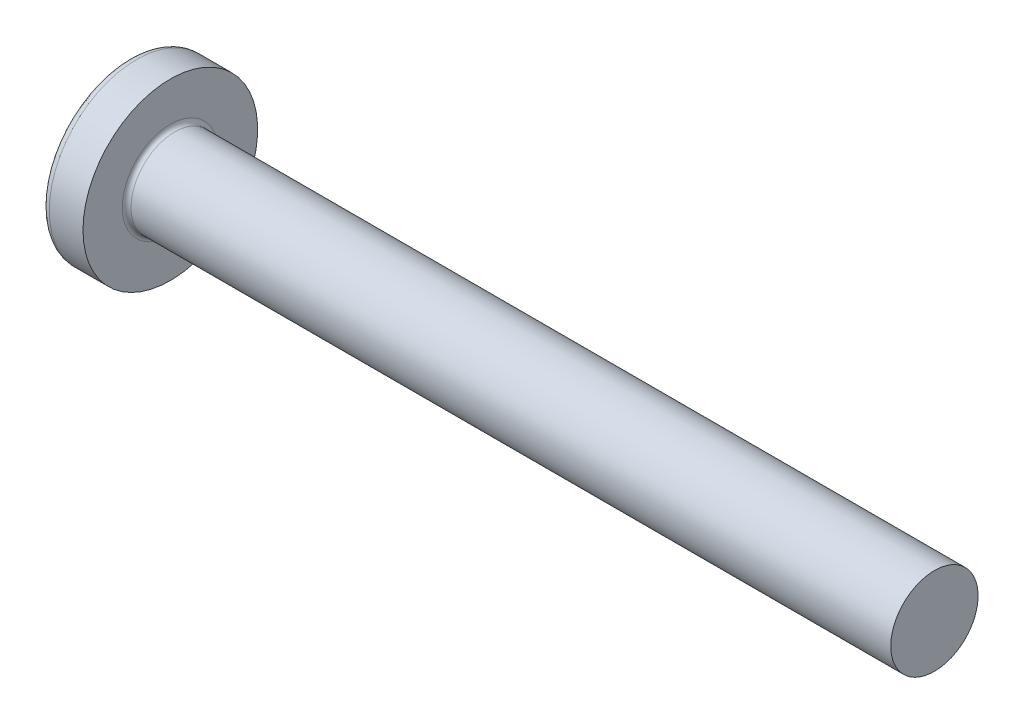
ISO-10303-21;
HEADER;
FILE_DESCRIPTION(('STEP AP214'),'2;1');
FILE_NAME('part.step','',(''),(''),'','','');
FILE_SCHEMA(('AUTOMOTIVE_DESIGN { 1 0 10303 214 1 1 1 1 }'));
ENDSEC;
DATA;
#1=APPLICATION_CONTEXT('core data for automotive mechanical design processes');
#2=APPLICATION_PROTOCOL_DEFINITION('international standard','automotive_design',2000,#1);
#3=PRODUCT_CONTEXT('',#1,'mechanical');
#4=PRODUCT('Part','Part','',(#3));
#5=PRODUCT_RELATED_PRODUCT_CATEGORY('part','',(#4));
#6=PRODUCT_DEFINITION_FORMATION('','',#4);
#7=PRODUCT_DEFINITION_CONTEXT('part definition',#1,'design');
#8=PRODUCT_DEFINITION('design','',#6,#7);
#9=PRODUCT_DEFINITION_SHAPE('','',#8);
#10=(LENGTH_UNIT() NAMED_UNIT(*) SI_UNIT(.MILLI.,.METRE.));
#11=(NAMED_UNIT(*) PLANE_ANGLE_UNIT() SI_UNIT($,.RADIAN.));
#12=(NAMED_UNIT(*) SI_UNIT($,.STERADIAN.) SOLID_ANGLE_UNIT());
#13=UNCERTAINTY_MEASURE_WITH_UNIT(LENGTH_MEASURE(1.E-05),#10,'distance_accuracy_value','');
#14=(GEOMETRIC_REPRESENTATION_CONTEXT(3) GLOBAL_UNCERTAINTY_ASSIGNED_CONTEXT((#13)) GLOBAL_UNIT_ASSIGNED_CONTEXT((#10,
#11,#12)) REPRESENTATION_CONTEXT('',''));
#15=CARTESIAN_POINT('',(0.,0.,0.));
#16=DIRECTION('',(0.,0.,1.));
#17=DIRECTION('',(1.,0.,0.));
#18=AXIS2_PLACEMENT_3D('',#15,#16,#17);
#19=CARTESIAN_POINT('',(6.5,0.,0.));
#20=DIRECTION('',(-1.,0.,0.));
#21=DIRECTION('',(0.,1.,0.));
#22=AXIS2_PLACEMENT_3D('',#19,#20,#21);
#23=SPHERICAL_SURFACE('',#22,6.5);
#24=CARTESIAN_POINT('',(1.26538895452803,0.,0.));
#25=DIRECTION('',(-1.,0.,0.));
#26=DIRECTION('',(0.,0.,1.));
#27=AXIS2_PLACEMENT_3D('',#24,#25,#26);
#28=CIRCLE('',#27,3.85342019543974);
#29=CARTESIAN_POINT('',(1.26538895452803,0.,3.85342019543974));
#30=VERTEX_POINT('',#29);
#31=EDGE_CURVE('E213',#30,#30,#28,.T.);
#32=ORIENTED_EDGE('',*,*,#31,.T.);
#33=EDGE_LOOP('',(#32));
#34=FACE_BOUND('',#33,.T.);
#35=CARTESIAN_POINT('',(0.0788099820016241,0.,0.));
#36=DIRECTION('',(1.,0.,0.));
#37=DIRECTION('',(0.,0.,-1.));
#38=AXIS2_PLACEMENT_3D('',#35,#36,#37);
#39=CIRCLE('',#38,1.0091178091571);
#40=CARTESIAN_POINT('',(0.0788099820016244,-0.514999999999996,-0.867809744562728));
#41=VERTEX_POINT('',#40);
#42=CARTESIAN_POINT('',(0.0788099820016241,-0.867809744562729,-0.515));
#43=VERTEX_POINT('',#42);
#44=EDGE_CURVE('E339',#41,#43,#39,.F.);
#45=ORIENTED_EDGE('',*,*,#44,.F.);
#46=CARTESIAN_POINT('',(6.5,-0.515000000000001,0.));
#47=DIRECTION('',(0.,1.,0.));
#48=DIRECTION('',(0.,0.,1.));
#49=AXIS2_PLACEMENT_3D('',#46,#47,#48);
#50=CIRCLE('',#49,6.47956595768575);
#51=CARTESIAN_POINT('',(0.331830520157854,-0.514999999999992,-1.98455543332603));
#52=VERTEX_POINT('',#51);
#53=EDGE_CURVE('E273',#52,#41,#50,.T.);
#54=ORIENTED_EDGE('',*,*,#53,.F.);
#55=CARTESIAN_POINT('',(6.06443225879603,0.,0.873613881878153));
#56=DIRECTION('',(0.446197753347436,0.,-0.894934391398443));
#57=DIRECTION('',(-0.894934391398442,0.,-0.446197753347436));
#58=AXIS2_PLACEMENT_3D('',#55,#56,#57);
#59=CIRCLE('',#58,6.42628038045433);
#60=CARTESIAN_POINT('',(0.331830520157856,0.515000000000007,-1.98455543332603));
#61=VERTEX_POINT('',#60);
#62=EDGE_CURVE('E247',#52,#61,#59,.T.);
#63=ORIENTED_EDGE('',*,*,#62,.T.);
#64=CARTESIAN_POINT('',(6.5,0.515,0.));
#65=DIRECTION('',(0.,-1.,0.));
#66=DIRECTION('',(0.,0.,-1.));
#67=AXIS2_PLACEMENT_3D('',#64,#65,#66);
#68=CIRCLE('',#67,6.47956595768574);
#69=CARTESIAN_POINT('',(0.0788099820016249,0.515000000000003,-0.867809744562724));
#70=VERTEX_POINT('',#69);
#71=EDGE_CURVE('E301',#70,#61,#68,.T.);
#72=ORIENTED_EDGE('',*,*,#71,.F.);
#73=CARTESIAN_POINT('',(0.0788099820016241,0.867809744562719,-0.515));
#74=VERTEX_POINT('',#73);
#75=EDGE_CURVE('E354',#74,#70,#39,.F.);
#76=ORIENTED_EDGE('',*,*,#75,.F.);
#77=CARTESIAN_POINT('',(6.5,0.,-0.515));
#78=DIRECTION('',(0.,0.,1.));
#79=DIRECTION('',(1.,0.,0.));
#80=AXIS2_PLACEMENT_3D('',#77,#78,#79);
#81=CIRCLE('',#80,6.47956595768574);
#82=CARTESIAN_POINT('',(0.331830520157856,1.98455543332603,-0.515));
#83=VERTEX_POINT('',#82);
#84=EDGE_CURVE('E241',#83,#74,#81,.T.);
#85=ORIENTED_EDGE('',*,*,#84,.F.);
#86=CARTESIAN_POINT('',(6.06443225879604,-0.873613881878154,0.));
#87=DIRECTION('',(0.446197753347436,0.894934391398443,0.));
#88=DIRECTION('',(-0.894934391398442,0.446197753347436,0.));
#89=AXIS2_PLACEMENT_3D('',#86,#87,#88);
#90=CIRCLE('',#89,6.42628038045433);
#91=CARTESIAN_POINT('',(0.331830520157857,1.98455543332603,0.515));
#92=VERTEX_POINT('',#91);
#93=EDGE_CURVE('E244',#83,#92,#90,.T.);
#94=ORIENTED_EDGE('',*,*,#93,.T.);
#95=CARTESIAN_POINT('',(6.5,0.,0.515000000000001));
#96=DIRECTION('',(0.,0.,-1.));
#97=DIRECTION('',(-1.,0.,0.));
#98=AXIS2_PLACEMENT_3D('',#95,#96,#97);
#99=CIRCLE('',#98,6.47956595768574);
#100=CARTESIAN_POINT('',(0.0788099820016241,0.867809744562719,0.514999999999999));
#101=VERTEX_POINT('',#100);
#102=EDGE_CURVE('E237',#101,#92,#99,.T.);
#103=ORIENTED_EDGE('',*,*,#102,.F.);
#104=CARTESIAN_POINT('',(0.0788099820016253,0.514999999999997,0.867809744562727));
#105=VERTEX_POINT('',#104);
#106=EDGE_CURVE('E353',#105,#101,#39,.F.);
#107=ORIENTED_EDGE('',*,*,#106,.F.);
#108=CARTESIAN_POINT('',(0.331830520157856,0.514999999999993,1.98455543332603));
#109=VERTEX_POINT('',#108);
#110=EDGE_CURVE('E257',#109,#105,#68,.T.);
#111=ORIENTED_EDGE('',*,*,#110,.F.);
#112=CARTESIAN_POINT('',(6.06443225879603,0.,-0.873613881878153));
#113=DIRECTION('',(0.446197753347436,0.,0.894934391398443));
#114=DIRECTION('',(0.894934391398442,0.,-0.446197753347436));
#115=AXIS2_PLACEMENT_3D('',#112,#113,#114);
#116=CIRCLE('',#115,6.42628038045433);
#117=CARTESIAN_POINT('',(0.331830520157855,-0.515000000000007,1.98455543332603));
#118=VERTEX_POINT('',#117);
#119=EDGE_CURVE('E48',#109,#118,#116,.T.);
#120=ORIENTED_EDGE('',*,*,#119,.T.);
#121=CARTESIAN_POINT('',(0.0788099820016247,-0.515000000000003,0.867809744562724));
#122=VERTEX_POINT('',#121);
#123=EDGE_CURVE('E254',#122,#118,#50,.T.);
#124=ORIENTED_EDGE('',*,*,#123,.F.);
#125=CARTESIAN_POINT('',(0.0788099820016241,-0.867809744562729,0.514999999999999));
#126=VERTEX_POINT('',#125);
#127=EDGE_CURVE('E385',#126,#122,#39,.F.);
#128=ORIENTED_EDGE('',*,*,#127,.F.);
#129=CARTESIAN_POINT('',(0.331830520157853,-1.98455543332603,0.514999999999999));
#130=VERTEX_POINT('',#129);
#131=EDGE_CURVE('E238',#130,#126,#99,.T.);
#132=ORIENTED_EDGE('',*,*,#131,.F.);
#133=CARTESIAN_POINT('',(6.06443225879603,0.873613881878152,0.));
#134=DIRECTION('',(0.446197753347436,-0.894934391398443,0.));
#135=DIRECTION('',(0.894934391398442,0.446197753347436,0.));
#136=AXIS2_PLACEMENT_3D('',#133,#134,#135);
#137=CIRCLE('',#136,6.42628038045433);
#138=CARTESIAN_POINT('',(0.331830520157853,-1.98455543332603,-0.515));
#139=VERTEX_POINT('',#138);
#140=EDGE_CURVE('E234',#130,#139,#137,.T.);
#141=ORIENTED_EDGE('',*,*,#140,.T.);
#142=EDGE_CURVE('E63',#43,#139,#81,.T.);
#143=ORIENTED_EDGE('',*,*,#142,.F.);
#144=EDGE_LOOP('',(#45,#54,#63,#72,#76,#85,#94,#103,#107,#111,#120,#124,#128,#132,#141,#143));
#145=FACE_BOUND('',#144,.T.);
#146=ADVANCED_FACE('F35',(#34,#145),#23,.T.);
#147=CARTESIAN_POINT('',(0.,2.15,-0.515));
#148=DIRECTION('',(0.,0.,1.));
#149=DIRECTION('',(1.,0.,0.));
#150=AXIS2_PLACEMENT_3D('',#147,#148,#149);
#151=PLANE('',#150);
#152=ORIENTED_EDGE('',*,*,#84,.T.);
#153=CARTESIAN_POINT('',(-1.51195208675156,0.994972220320188,-0.515));
#154=CARTESIAN_POINT('',(-1.20405981949279,0.970722016949958,-0.515));
#155=CARTESIAN_POINT('',(-0.896180907521174,0.946299109919651,-0.515));
#156=CARTESIAN_POINT('',(-0.280449079832185,0.896981122427851,-0.515));
#157=CARTESIAN_POINT('',(0.0274038344396873,0.872086023934883,-0.515));
#158=CARTESIAN_POINT('',(0.489146739515351,0.83429553519528,-0.515));
#159=CARTESIAN_POINT('',(0.643055047553846,0.821624058404092,-0.515));
#160=CARTESIAN_POINT('',(0.950856520197141,0.796108332639504,-0.515));
#161=CARTESIAN_POINT('',(1.10474968487868,0.783264084592465,-0.515));
#162=CARTESIAN_POINT('',(1.41251352095103,0.757376569093378,-0.515));
#163=CARTESIAN_POINT('',(1.56638419296577,0.744333309065218,-0.515));
#164=CARTESIAN_POINT('',(1.87410847343335,0.718013273188896,-0.515));
#165=CARTESIAN_POINT('',(2.02796208151372,0.704736492982792,-0.515));
#166=CARTESIAN_POINT('',(2.36455311890989,0.675386943006726,-0.515));
#167=CARTESIAN_POINT('',(2.54728562293342,0.659257575640986,-0.515));
#168=CARTESIAN_POINT('',(2.91270624109256,0.626517182479888,-0.515));
#169=CARTESIAN_POINT('',(3.09539435554038,0.609906160177238,-0.515));
#170=CARTESIAN_POINT('',(3.46069832191612,0.576073027116421,-0.515));
#171=CARTESIAN_POINT('',(3.64331417870068,0.558850968932727,-0.515));
#172=CARTESIAN_POINT('',(4.00847437496567,0.523604864540037,-0.515));
#173=CARTESIAN_POINT('',(4.19101871216888,0.505580794604253,-0.515));
#174=CARTESIAN_POINT('',(4.55606208157937,0.468429191666488,-0.515));
#175=CARTESIAN_POINT('',(4.73856107358022,0.449301262281854,-0.515));
#176=CARTESIAN_POINT('',(5.10337547353418,0.409473604748924,-0.515));
#177=CARTESIAN_POINT('',(5.28569089526422,0.388774005106069,-0.515));
#178=CARTESIAN_POINT('',(5.55897278495412,0.355828287527264,-0.515));
#179=CARTESIAN_POINT('',(5.65005277419686,0.344527918782738,-0.515));
#180=CARTESIAN_POINT('',(5.83209904103607,0.321075174263031,-0.515));
#181=CARTESIAN_POINT('',(5.92306532397915,0.308922840209686,-0.515));
#182=CARTESIAN_POINT('',(6.10486078872898,0.28342733445193,-0.515));
#183=CARTESIAN_POINT('',(6.19568992299379,0.270083817601714,-0.515));
#184=CARTESIAN_POINT('',(6.33172773785679,0.248701420809951,-0.515));
#185=CARTESIAN_POINT('',(6.37704304473344,0.241345446705304,-0.515));
#186=CARTESIAN_POINT('',(6.4675722520141,0.226018953559337,-0.515));
#187=CARTESIAN_POINT('',(6.51278614568083,0.218048394864476,-0.515));
#188=CARTESIAN_POINT('',(6.55793125759548,0.209691465274944,-0.515));
#189=B_SPLINE_CURVE_WITH_KNOTS('',3,(#153,#154,#155,#156,#157,#158,#159,#160,#161,#162,#163,
#164,#165,#166,#167,#168,#169,#170,#171,#172,#173,#174,#175,#176,#177,#178,#179,#180,#181,#182,
#183,#184,#185,#186,#187,#188),.UNSPECIFIED.,.F.,.F.,(4,2,2,2,2,2,2,2,2,2,2,2,2,2,2,2,2,4),(0.,
0.926537709781721,1.85311087258339,2.31639796016285,2.77968256468771,3.24294992902055,
3.70622594801777,4.25655436065378,4.80687878359543,5.35715597005738,5.90744944680718,
6.45794177197673,7.008389135274,7.28372117336898,7.55903973750591,7.83443833587748,
7.97216007460854,8.10989070671571),.UNSPECIFIED.);
#190=CARTESIAN_POINT('',(2.34,0.677477674908923,-0.515));
#191=VERTEX_POINT('',#190);
#192=EDGE_CURVE('E374',#74,#191,#189,.T.);
#193=ORIENTED_EDGE('',*,*,#192,.T.);
#194=DIRECTION('',(0.,1.,0.));
#195=VECTOR('',#194,1.);
#196=CARTESIAN_POINT('',(2.34,-0.983319232260742,-0.515));
#197=LINE('',#196,#195);
#198=CARTESIAN_POINT('',(2.34,0.983319232260743,-0.515));
#199=VERTEX_POINT('',#198);
#200=EDGE_CURVE('E322',#191,#199,#197,.T.);
#201=ORIENTED_EDGE('',*,*,#200,.T.);
#202=DIRECTION('',(0.894934391398442,-0.446197753347436,0.));
#203=VECTOR('',#202,1.);
#204=CARTESIAN_POINT('',(0.,2.15,-0.515));
#205=LINE('',#204,#203);
#206=EDGE_CURVE('E214',#83,#199,#205,.T.);
#207=ORIENTED_EDGE('',*,*,#206,.F.);
#208=EDGE_LOOP('',(#152,#193,#201,#207));
#209=FACE_BOUND('',#208,.T.);
#210=ADVANCED_FACE('F169',(#209),#151,.T.);
#211=CARTESIAN_POINT('',(2.34,-0.983319232260742,-0.515));
#212=VERTEX_POINT('',#211);
#213=CARTESIAN_POINT('',(2.34,-0.677477674908923,-0.515));
#214=VERTEX_POINT('',#213);
#215=EDGE_CURVE('E222',#212,#214,#197,.T.);
#216=ORIENTED_EDGE('',*,*,#215,.T.);
#217=CARTESIAN_POINT('',(-1.51195208675156,-0.994972220320188,-0.515));
#218=CARTESIAN_POINT('',(-1.20405981949279,-0.970722016949958,-0.515));
#219=CARTESIAN_POINT('',(-0.896180907521174,-0.946299109919651,-0.515));
#220=CARTESIAN_POINT('',(-0.280449079832185,-0.896981122427851,-0.515));
#221=CARTESIAN_POINT('',(0.027403834439687,-0.872086023934883,-0.515));
#222=CARTESIAN_POINT('',(0.48914673951535,-0.83429553519528,-0.515));
#223=CARTESIAN_POINT('',(0.643055047553845,-0.821624058404092,-0.515));
#224=CARTESIAN_POINT('',(0.95085652019714,-0.796108332639504,-0.515));
#225=CARTESIAN_POINT('',(1.10474968487868,-0.783264084592466,-0.515));
#226=CARTESIAN_POINT('',(1.41251352095103,-0.757376569093378,-0.515));
#227=CARTESIAN_POINT('',(1.56638419296577,-0.744333309065218,-0.515));
#228=CARTESIAN_POINT('',(1.87410847343335,-0.718013273188896,-0.515));
#229=CARTESIAN_POINT('',(2.02796208151372,-0.704736492982792,-0.515));
#230=CARTESIAN_POINT('',(2.36455311890989,-0.675386943006726,-0.515));
#231=CARTESIAN_POINT('',(2.54728562293342,-0.659257575640986,-0.515));
#232=CARTESIAN_POINT('',(2.91270624109256,-0.626517182479888,-0.515));
#233=CARTESIAN_POINT('',(3.09539435554038,-0.609906160177238,-0.515));
#234=CARTESIAN_POINT('',(3.46069832191613,-0.576073027116421,-0.515));
#235=CARTESIAN_POINT('',(3.64331417870068,-0.558850968932727,-0.515));
#236=CARTESIAN_POINT('',(4.00847437496567,-0.523604864540037,-0.515));
#237=CARTESIAN_POINT('',(4.19101871216888,-0.505580794604252,-0.515));
#238=CARTESIAN_POINT('',(4.55606208157937,-0.468429191666487,-0.515));
#239=CARTESIAN_POINT('',(4.73856107358023,-0.449301262281853,-0.515));
#240=CARTESIAN_POINT('',(5.10337547353419,-0.409473604748924,-0.515));
#241=CARTESIAN_POINT('',(5.28569089526422,-0.388774005106069,-0.515));
#242=CARTESIAN_POINT('',(5.55897278495412,-0.355828287527264,-0.515));
#243=CARTESIAN_POINT('',(5.65005277419686,-0.344527918782738,-0.515));
#244=CARTESIAN_POINT('',(5.83209904103608,-0.32107517426303,-0.515));
#245=CARTESIAN_POINT('',(5.92306532397915,-0.308922840209685,-0.515));
#246=CARTESIAN_POINT('',(6.10486078872898,-0.283427334451929,-0.515));
#247=CARTESIAN_POINT('',(6.1956899229938,-0.270083817601713,-0.515));
#248=CARTESIAN_POINT('',(6.33172773785679,-0.24870142080995,-0.515));
#249=CARTESIAN_POINT('',(6.37704304473344,-0.241345446705303,-0.515));
#250=CARTESIAN_POINT('',(6.4675722520141,-0.226018953559337,-0.515));
#251=CARTESIAN_POINT('',(6.51278614568083,-0.218048394864475,-0.515));
#252=CARTESIAN_POINT('',(6.55793125759549,-0.209691465274944,-0.515));
#253=B_SPLINE_CURVE_WITH_KNOTS('',3,(#217,#218,#219,#220,#221,#222,#223,#224,#225,#226,#227,
#228,#229,#230,#231,#232,#233,#234,#235,#236,#237,#238,#239,#240,#241,#242,#243,#244,#245,#246,
#247,#248,#249,#250,#251,#252),.UNSPECIFIED.,.F.,.F.,(4,2,2,2,2,2,2,2,2,2,2,2,2,2,2,2,2,4),(0.,
0.926537709781721,1.85311087258339,2.31639796016285,2.77968256468771,3.24294992902054,
3.70622594801777,4.25655436065378,4.80687878359543,5.35715597005738,5.90744944680718,
6.45794177197673,7.008389135274,7.28372117336899,7.55903973750591,7.83443833587749,
7.97216007460855,8.10989070671571),.UNSPECIFIED.);
#254=EDGE_CURVE('E352',#214,#43,#253,.F.);
#255=ORIENTED_EDGE('',*,*,#254,.T.);
#256=ORIENTED_EDGE('',*,*,#142,.T.);
#257=DIRECTION('',(0.894934391398442,0.446197753347436,0.));
#258=VECTOR('',#257,1.);
#259=CARTESIAN_POINT('',(0.,-2.15,-0.515));
#260=LINE('',#259,#258);
#261=EDGE_CURVE('E304',#139,#212,#260,.T.);
#262=ORIENTED_EDGE('',*,*,#261,.T.);
#263=EDGE_LOOP('',(#216,#255,#256,#262));
#264=FACE_BOUND('',#263,.T.);
#265=ADVANCED_FACE('F175',(#264),#151,.T.);
#266=CARTESIAN_POINT('',(0.,-2.15,0.514999999999999));
#267=DIRECTION('',(0.,0.,-1.));
#268=DIRECTION('',(-1.,0.,0.));
#269=AXIS2_PLACEMENT_3D('',#266,#267,#268);
#270=PLANE('',#269);
#271=DIRECTION('',(0.,-1.,0.));
#272=VECTOR('',#271,1.);
#273=CARTESIAN_POINT('',(2.34,0.983319232260742,0.515));
#274=LINE('',#273,#272);
#275=CARTESIAN_POINT('',(2.34,0.983319232260743,0.515));
#276=VERTEX_POINT('',#275);
#277=CARTESIAN_POINT('',(2.34,0.677477674908923,0.515));
#278=VERTEX_POINT('',#277);
#279=EDGE_CURVE('E312',#276,#278,#274,.T.);
#280=ORIENTED_EDGE('',*,*,#279,.T.);
#281=CARTESIAN_POINT('',(-1.51195208675156,0.994972220320188,0.514999999999999));
#282=CARTESIAN_POINT('',(-1.20405981949279,0.970722016949958,0.514999999999999));
#283=CARTESIAN_POINT('',(-0.896180907521173,0.946299109919651,0.514999999999999));
#284=CARTESIAN_POINT('',(-0.280449079832184,0.896981122427852,0.514999999999999));
#285=CARTESIAN_POINT('',(0.0274038344396879,0.872086023934883,0.514999999999999));
#286=CARTESIAN_POINT('',(0.489146739515351,0.83429553519528,0.515));
#287=CARTESIAN_POINT('',(0.643055047553846,0.821624058404092,0.515));
#288=CARTESIAN_POINT('',(0.950856520197141,0.796108332639504,0.515));
#289=CARTESIAN_POINT('',(1.10474968487868,0.783264084592466,0.515));
#290=CARTESIAN_POINT('',(1.41251352095103,0.757376569093379,0.515));
#291=CARTESIAN_POINT('',(1.56638419296577,0.744333309065218,0.515));
#292=CARTESIAN_POINT('',(1.87410847343335,0.718013273188896,0.515));
#293=CARTESIAN_POINT('',(2.02796208151372,0.704736492982792,0.515));
#294=CARTESIAN_POINT('',(2.36455311890989,0.675386943006726,0.515));
#295=CARTESIAN_POINT('',(2.54728562293342,0.659257575640986,0.515));
#296=CARTESIAN_POINT('',(2.91270624109256,0.626517182479888,0.515));
#297=CARTESIAN_POINT('',(3.09539435554038,0.609906160177238,0.515));
#298=CARTESIAN_POINT('',(3.46069832191613,0.576073027116421,0.515));
#299=CARTESIAN_POINT('',(3.64331417870068,0.558850968932727,0.515));
#300=CARTESIAN_POINT('',(4.00847437496567,0.523604864540037,0.515));
#301=CARTESIAN_POINT('',(4.19101871216888,0.505580794604252,0.515));
#302=CARTESIAN_POINT('',(4.55606208157937,0.468429191666487,0.515));
#303=CARTESIAN_POINT('',(4.73856107358023,0.449301262281853,0.515000000000001));
#304=CARTESIAN_POINT('',(5.10337547353419,0.409473604748924,0.515000000000001));
#305=CARTESIAN_POINT('',(5.28569089526422,0.388774005106069,0.515000000000001));
#306=CARTESIAN_POINT('',(5.55897278495412,0.355828287527263,0.515000000000001));
#307=CARTESIAN_POINT('',(5.65005277419686,0.344527918782737,0.515000000000001));
#308=CARTESIAN_POINT('',(5.83209904103608,0.32107517426303,0.515000000000001));
#309=CARTESIAN_POINT('',(5.92306532397915,0.308922840209685,0.515000000000001));
#310=CARTESIAN_POINT('',(6.10486078872898,0.283427334451929,0.515000000000001));
#311=CARTESIAN_POINT('',(6.1956899229938,0.270083817601713,0.515000000000001));
#312=CARTESIAN_POINT('',(6.33172773785679,0.248701420809949,0.515000000000001));
#313=CARTESIAN_POINT('',(6.37704304473344,0.241345446705302,0.515000000000001));
#314=CARTESIAN_POINT('',(6.4675722520141,0.226018953559336,0.515000000000001));
#315=CARTESIAN_POINT('',(6.51278614568083,0.218048394864474,0.515000000000001));
#316=CARTESIAN_POINT('',(6.55793125759549,0.209691465274942,0.515000000000001));
#317=B_SPLINE_CURVE_WITH_KNOTS('',3,(#281,#282,#283,#284,#285,#286,#287,#288,#289,#290,#291,
#292,#293,#294,#295,#296,#297,#298,#299,#300,#301,#302,#303,#304,#305,#306,#307,#308,#309,#310,
#311,#312,#313,#314,#315,#316),.UNSPECIFIED.,.F.,.F.,(4,2,2,2,2,2,2,2,2,2,2,2,2,2,2,2,2,4),(0.,
0.926537709781721,1.85311087258339,2.31639796016285,2.77968256468771,3.24294992902054,
3.70622594801777,4.25655436065378,4.80687878359543,5.35715597005738,5.90744944680718,
6.45794177197673,7.008389135274,7.28372117336899,7.55903973750591,7.83443833587749,
7.97216007460855,8.10989070671571),.UNSPECIFIED.);
#318=EDGE_CURVE('E278',#278,#101,#317,.F.);
#319=ORIENTED_EDGE('',*,*,#318,.T.);
#320=ORIENTED_EDGE('',*,*,#102,.T.);
#321=DIRECTION('',(0.894934391398442,-0.446197753347436,0.));
#322=VECTOR('',#321,1.);
#323=CARTESIAN_POINT('',(0.,2.15,0.515));
#324=LINE('',#323,#322);
#325=EDGE_CURVE('E219',#92,#276,#324,.T.);
#326=ORIENTED_EDGE('',*,*,#325,.T.);
#327=EDGE_LOOP('',(#280,#319,#320,#326));
#328=FACE_BOUND('',#327,.T.);
#329=ADVANCED_FACE('F370',(#328),#270,.T.);
#330=ORIENTED_EDGE('',*,*,#131,.T.);
#331=CARTESIAN_POINT('',(-1.51195208675156,-0.994972220320188,0.514999999999999));
#332=CARTESIAN_POINT('',(-1.20405981949279,-0.970722016949958,0.514999999999999));
#333=CARTESIAN_POINT('',(-0.896180907521174,-0.946299109919651,0.514999999999999));
#334=CARTESIAN_POINT('',(-0.280449079832185,-0.896981122427852,0.514999999999999));
#335=CARTESIAN_POINT('',(0.0274038344396874,-0.872086023934883,0.514999999999999));
#336=CARTESIAN_POINT('',(0.489146739515351,-0.83429553519528,0.514999999999999));
#337=CARTESIAN_POINT('',(0.643055047553846,-0.821624058404092,0.514999999999999));
#338=CARTESIAN_POINT('',(0.950856520197141,-0.796108332639504,0.514999999999999));
#339=CARTESIAN_POINT('',(1.10474968487868,-0.783264084592466,0.515));
#340=CARTESIAN_POINT('',(1.41251352095103,-0.757376569093379,0.515));
#341=CARTESIAN_POINT('',(1.56638419296577,-0.744333309065218,0.515));
#342=CARTESIAN_POINT('',(1.87410847343335,-0.718013273188896,0.515));
#343=CARTESIAN_POINT('',(2.02796208151372,-0.704736492982792,0.515));
#344=CARTESIAN_POINT('',(2.36455311890989,-0.675386943006726,0.515));
#345=CARTESIAN_POINT('',(2.54728562293342,-0.659257575640986,0.515));
#346=CARTESIAN_POINT('',(2.91270624109256,-0.626517182479888,0.515));
#347=CARTESIAN_POINT('',(3.09539435554038,-0.609906160177238,0.515));
#348=CARTESIAN_POINT('',(3.46069832191613,-0.576073027116421,0.515));
#349=CARTESIAN_POINT('',(3.64331417870068,-0.558850968932727,0.515));
#350=CARTESIAN_POINT('',(4.00847437496567,-0.523604864540037,0.515));
#351=CARTESIAN_POINT('',(4.19101871216888,-0.505580794604253,0.515));
#352=CARTESIAN_POINT('',(4.55606208157937,-0.468429191666487,0.515));
#353=CARTESIAN_POINT('',(4.73856107358022,-0.449301262281853,0.515));
#354=CARTESIAN_POINT('',(5.10337547353418,-0.409473604748924,0.515));
#355=CARTESIAN_POINT('',(5.28569089526422,-0.388774005106069,0.515));
#356=CARTESIAN_POINT('',(5.55897278495412,-0.355828287527263,0.515000000000001));
#357=CARTESIAN_POINT('',(5.65005277419686,-0.344527918782738,0.515000000000001));
#358=CARTESIAN_POINT('',(5.83209904103607,-0.32107517426303,0.515000000000001));
#359=CARTESIAN_POINT('',(5.92306532397915,-0.308922840209685,0.515000000000001));
#360=CARTESIAN_POINT('',(6.10486078872898,-0.283427334451929,0.515000000000001));
#361=CARTESIAN_POINT('',(6.19568992299379,-0.270083817601713,0.515000000000001));
#362=CARTESIAN_POINT('',(6.33172773785679,-0.24870142080995,0.515000000000001));
#363=CARTESIAN_POINT('',(6.37704304473344,-0.241345446705303,0.515000000000001));
#364=CARTESIAN_POINT('',(6.4675722520141,-0.226018953559336,0.515000000000001));
#365=CARTESIAN_POINT('',(6.51278614568083,-0.218048394864474,0.515000000000001));
#366=CARTESIAN_POINT('',(6.55793125759549,-0.209691465274943,0.515000000000001));
#367=B_SPLINE_CURVE_WITH_KNOTS('',3,(#331,#332,#333,#334,#335,#336,#337,#338,#339,#340,#341,
#342,#343,#344,#345,#346,#347,#348,#349,#350,#351,#352,#353,#354,#355,#356,#357,#358,#359,#360,
#361,#362,#363,#364,#365,#366),.UNSPECIFIED.,.F.,.F.,(4,2,2,2,2,2,2,2,2,2,2,2,2,2,2,2,2,4),(0.,
0.926537709781721,1.85311087258339,2.31639796016285,2.77968256468771,3.24294992902055,
3.70622594801777,4.25655436065378,4.80687878359543,5.35715597005738,5.90744944680718,
6.45794177197673,7.008389135274,7.28372117336899,7.55903973750591,7.83443833587748,
7.97216007460854,8.10989070671571),.UNSPECIFIED.);
#368=CARTESIAN_POINT('',(2.34,-0.677477674908923,0.515));
#369=VERTEX_POINT('',#368);
#370=EDGE_CURVE('E386',#126,#369,#367,.T.);
#371=ORIENTED_EDGE('',*,*,#370,.T.);
#372=CARTESIAN_POINT('',(2.34,-0.983319232260743,0.515));
#373=VERTEX_POINT('',#372);
#374=EDGE_CURVE('E314',#369,#373,#274,.T.);
#375=ORIENTED_EDGE('',*,*,#374,.T.);
#376=DIRECTION('',(0.894934391398443,0.446197753347436,0.));
#377=VECTOR('',#376,1.);
#378=CARTESIAN_POINT('',(0.,-2.15,0.514999999999999));
#379=LINE('',#378,#377);
#380=EDGE_CURVE('E306',#130,#373,#379,.T.);
#381=ORIENTED_EDGE('',*,*,#380,.F.);
#382=EDGE_LOOP('',(#330,#371,#375,#381));
#383=FACE_BOUND('',#382,.T.);
#384=ADVANCED_FACE('F413',(#383),#270,.T.);
#385=CARTESIAN_POINT('',(2.34,0.983319232260742,-0.515));
#386=DIRECTION('',(-1.,0.,0.));
#387=DIRECTION('',(0.,0.,1.));
#388=AXIS2_PLACEMENT_3D('',#385,#386,#387);
#389=PLANE('',#388);
#390=ORIENTED_EDGE('',*,*,#374,.F.);
#391=CARTESIAN_POINT('',(2.34,0.,0.));
#392=DIRECTION('',(-1.,0.,0.));
#393=DIRECTION('',(0.,0.,1.));
#394=AXIS2_PLACEMENT_3D('',#391,#392,#393);
#395=CIRCLE('',#394,0.851);
#396=EDGE_CURVE('E347',#214,#369,#395,.T.);
#397=ORIENTED_EDGE('',*,*,#396,.F.);
#398=ORIENTED_EDGE('',*,*,#215,.F.);
#399=DIRECTION('',(0.,0.,1.));
#400=VECTOR('',#399,1.);
#401=CARTESIAN_POINT('',(2.34,-0.983319232260742,-0.515));
#402=LINE('',#401,#400);
#403=EDGE_CURVE('E309',#212,#373,#402,.T.);
#404=ORIENTED_EDGE('',*,*,#403,.T.);
#405=EDGE_LOOP('',(#390,#397,#398,#404));
#406=FACE_BOUND('',#405,.T.);
#407=ADVANCED_FACE('F411',(#406),#389,.T.);
#408=DIRECTION('',(0.,0.,-1.));
#409=VECTOR('',#408,1.);
#410=CARTESIAN_POINT('',(2.34,-0.515000000000004,0.983319232260741));
#411=LINE('',#410,#409);
#412=CARTESIAN_POINT('',(2.34,-0.514999999999997,-0.677477674908925));
#413=VERTEX_POINT('',#412);
#414=CARTESIAN_POINT('',(2.34,-0.514999999999996,-0.983319232260744));
#415=VERTEX_POINT('',#414);
#416=EDGE_CURVE('E295',#413,#415,#411,.T.);
#417=ORIENTED_EDGE('',*,*,#416,.F.);
#418=CARTESIAN_POINT('',(2.34,0.515000000000003,-0.677477674908921));
#419=VERTEX_POINT('',#418);
#420=EDGE_CURVE('E55',#419,#413,#395,.T.);
#421=ORIENTED_EDGE('',*,*,#420,.F.);
#422=DIRECTION('',(0.,0.,1.));
#423=VECTOR('',#422,1.);
#424=CARTESIAN_POINT('',(2.34,0.515000000000004,-0.983319232260741));
#425=LINE('',#424,#423);
#426=CARTESIAN_POINT('',(2.34,0.515000000000004,-0.983319232260741));
#427=VERTEX_POINT('',#426);
#428=EDGE_CURVE('E298',#427,#419,#425,.T.);
#429=ORIENTED_EDGE('',*,*,#428,.F.);
#430=DIRECTION('',(0.,-1.,0.));
#431=VECTOR('',#430,1.);
#432=CARTESIAN_POINT('',(2.34,0.515000000000004,-0.983319232260741));
#433=LINE('',#432,#431);
#434=EDGE_CURVE('E289',#427,#415,#433,.T.);
#435=ORIENTED_EDGE('',*,*,#434,.T.);
#436=EDGE_LOOP('',(#417,#421,#429,#435));
#437=FACE_BOUND('',#436,.T.);
#438=ADVANCED_FACE('F342',(#437),#389,.T.);
#439=ORIENTED_EDGE('',*,*,#200,.F.);
#440=EDGE_CURVE('E346',#278,#191,#395,.T.);
#441=ORIENTED_EDGE('',*,*,#440,.F.);
#442=ORIENTED_EDGE('',*,*,#279,.F.);
#443=DIRECTION('',(0.,0.,-1.));
#444=VECTOR('',#443,1.);
#445=CARTESIAN_POINT('',(2.34,0.983319232260742,0.515));
#446=LINE('',#445,#444);
#447=EDGE_CURVE('E315',#276,#199,#446,.T.);
#448=ORIENTED_EDGE('',*,*,#447,.T.);
#449=EDGE_LOOP('',(#439,#441,#442,#448));
#450=FACE_BOUND('',#449,.T.);
#451=ADVANCED_FACE('F420',(#450),#389,.T.);
#452=CARTESIAN_POINT('',(2.34,0.514999999999998,0.677477674908924));
#453=VERTEX_POINT('',#452);
#454=CARTESIAN_POINT('',(2.34,0.514999999999997,0.983319232260744));
#455=VERTEX_POINT('',#454);
#456=EDGE_CURVE('E271',#453,#455,#425,.T.);
#457=ORIENTED_EDGE('',*,*,#456,.F.);
#458=CARTESIAN_POINT('',(2.34,-0.515000000000003,0.677477674908921));
#459=VERTEX_POINT('',#458);
#460=EDGE_CURVE('E350',#459,#453,#395,.T.);
#461=ORIENTED_EDGE('',*,*,#460,.F.);
#462=CARTESIAN_POINT('',(2.34,-0.515000000000004,0.983319232260741));
#463=VERTEX_POINT('',#462);
#464=EDGE_CURVE('E292',#463,#459,#411,.T.);
#465=ORIENTED_EDGE('',*,*,#464,.F.);
#466=DIRECTION('',(0.,1.,0.));
#467=VECTOR('',#466,1.);
#468=CARTESIAN_POINT('',(2.34,-0.515000000000004,0.983319232260741));
#469=LINE('',#468,#467);
#470=EDGE_CURVE('E296',#463,#455,#469,.T.);
#471=ORIENTED_EDGE('',*,*,#470,.T.);
#472=EDGE_LOOP('',(#457,#461,#465,#471));
#473=FACE_BOUND('',#472,.T.);
#474=ADVANCED_FACE('F415',(#473),#389,.T.);
#475=CARTESIAN_POINT('',(0.,0.514999999999993,2.15));
#476=DIRECTION('',(0.,-1.,0.));
#477=DIRECTION('',(1.,0.,0.));
#478=AXIS2_PLACEMENT_3D('',#475,#476,#477);
#479=PLANE('',#478);
#480=ORIENTED_EDGE('',*,*,#110,.T.);
#481=CARTESIAN_POINT('',(-1.51195208675156,0.514999999999997,0.994972220320189));
#482=CARTESIAN_POINT('',(-1.20405981949279,0.514999999999997,0.97072201694996));
#483=CARTESIAN_POINT('',(-0.896180907521173,0.514999999999997,0.946299109919652));
#484=CARTESIAN_POINT('',(-0.280449079832184,0.514999999999997,0.896981122427853));
#485=CARTESIAN_POINT('',(0.0274038344396879,0.514999999999997,0.872086023934884));
#486=CARTESIAN_POINT('',(0.489146739515351,0.514999999999997,0.834295535195282));
#487=CARTESIAN_POINT('',(0.643055047553846,0.514999999999997,0.821624058404094));
#488=CARTESIAN_POINT('',(0.950856520197141,0.514999999999997,0.796108332639506));
#489=CARTESIAN_POINT('',(1.10474968487868,0.514999999999997,0.783264084592467));
#490=CARTESIAN_POINT('',(1.41251352095103,0.514999999999997,0.75737656909338));
#491=CARTESIAN_POINT('',(1.56638419296577,0.514999999999997,0.74433330906522));
#492=CARTESIAN_POINT('',(1.87410847343335,0.514999999999998,0.718013273188897));
#493=CARTESIAN_POINT('',(2.02796208151372,0.514999999999998,0.704736492982794));
#494=CARTESIAN_POINT('',(2.36455311890989,0.514999999999998,0.675386943006728));
#495=CARTESIAN_POINT('',(2.54728562293342,0.514999999999998,0.659257575640987));
#496=CARTESIAN_POINT('',(2.91270624109256,0.514999999999998,0.626517182479889));
#497=CARTESIAN_POINT('',(3.09539435554038,0.514999999999998,0.60990616017724));
#498=CARTESIAN_POINT('',(3.46069832191613,0.514999999999998,0.576073027116423));
#499=CARTESIAN_POINT('',(3.64331417870068,0.514999999999998,0.558850968932729));
#500=CARTESIAN_POINT('',(4.00847437496567,0.514999999999998,0.523604864540039));
#501=CARTESIAN_POINT('',(4.19101871216888,0.514999999999998,0.505580794604254));
#502=CARTESIAN_POINT('',(4.55606208157937,0.514999999999999,0.468429191666489));
#503=CARTESIAN_POINT('',(4.73856107358023,0.514999999999999,0.449301262281855));
#504=CARTESIAN_POINT('',(5.10337547353419,0.514999999999999,0.409473604748926));
#505=CARTESIAN_POINT('',(5.28569089526422,0.514999999999999,0.388774005106071));
#506=CARTESIAN_POINT('',(5.55897278495412,0.514999999999999,0.355828287527265));
#507=CARTESIAN_POINT('',(5.65005277419686,0.514999999999999,0.344527918782739));
#508=CARTESIAN_POINT('',(5.83209904103608,0.514999999999999,0.321075174263032));
#509=CARTESIAN_POINT('',(5.92306532397915,0.514999999999999,0.308922840209687));
#510=CARTESIAN_POINT('',(6.10486078872898,0.514999999999999,0.283427334451931));
#511=CARTESIAN_POINT('',(6.19568992299379,0.514999999999999,0.270083817601715));
#512=CARTESIAN_POINT('',(6.33172773785679,0.514999999999999,0.248701420809952));
#513=CARTESIAN_POINT('',(6.37704304473344,0.514999999999999,0.241345446705305));
#514=CARTESIAN_POINT('',(6.4675722520141,0.514999999999999,0.226018953559339));
#515=CARTESIAN_POINT('',(6.51278614568083,0.514999999999999,0.218048394864478));
#516=CARTESIAN_POINT('',(6.55793125759549,0.515,0.209691465274946));
#517=B_SPLINE_CURVE_WITH_KNOTS('',3,(#481,#482,#483,#484,#485,#486,#487,#488,#489,#490,#491,
#492,#493,#494,#495,#496,#497,#498,#499,#500,#501,#502,#503,#504,#505,#506,#507,#508,#509,#510,
#511,#512,#513,#514,#515,#516),.UNSPECIFIED.,.F.,.F.,(4,2,2,2,2,2,2,2,2,2,2,2,2,2,2,2,2,4),(0.,
0.926537709781721,1.85311087258339,2.31639796016285,2.77968256468771,3.24294992902054,
3.70622594801777,4.25655436065378,4.80687878359543,5.35715597005738,5.90744944680718,
6.45794177197673,7.008389135274,7.28372117336899,7.55903973750591,7.83443833587748,
7.97216007460854,8.10989070671571),.UNSPECIFIED.);
#518=EDGE_CURVE('E434',#105,#453,#517,.T.);
#519=ORIENTED_EDGE('',*,*,#518,.T.);
#520=ORIENTED_EDGE('',*,*,#456,.T.);
#521=DIRECTION('',(0.894934391398442,0.,-0.446197753347436));
#522=VECTOR('',#521,1.);
#523=CARTESIAN_POINT('',(0.,0.514999999999993,2.15));
#524=LINE('',#523,#522);
#525=EDGE_CURVE('E264',#109,#455,#524,.T.);
#526=ORIENTED_EDGE('',*,*,#525,.F.);
#527=EDGE_LOOP('',(#480,#519,#520,#526));
#528=FACE_BOUND('',#527,.T.);
#529=ADVANCED_FACE('F268',(#528),#479,.T.);
#530=CARTESIAN_POINT('',(0.,-0.514999999999992,-2.15));
#531=DIRECTION('',(0.,1.,0.));
#532=DIRECTION('',(-1.,0.,0.));
#533=AXIS2_PLACEMENT_3D('',#530,#531,#532);
#534=PLANE('',#533);
#535=ORIENTED_EDGE('',*,*,#464,.T.);
#536=CARTESIAN_POINT('',(-1.51195208754037,-0.515000000000003,0.994972220382296));
#537=CARTESIAN_POINT('',(-1.20405982018868,-0.515000000000003,0.970722017005062));
#538=CARTESIAN_POINT('',(-0.896180908124144,-0.515000000000003,0.946299109967687));
#539=CARTESIAN_POINT('',(-0.280449080249313,-0.515000000000003,0.896981122461526));
#540=CARTESIAN_POINT('',(0.027403834115485,-0.515000000000003,0.872086023961263));
#541=CARTESIAN_POINT('',(0.489146739371409,-0.515000000000003,0.834295535207135));
#542=CARTESIAN_POINT('',(0.643055047497245,-0.515000000000003,0.821624058408794));
#543=CARTESIAN_POINT('',(0.950856520315204,-0.515000000000003,0.796108332629704));
#544=CARTESIAN_POINT('',(1.10474968508407,-0.515000000000003,0.783264084575316));
#545=CARTESIAN_POINT('',(1.41251352133103,-0.515000000000003,0.757376569061286));
#546=CARTESIAN_POINT('',(1.56638419343305,-0.515000000000003,0.744333309025532));
#547=CARTESIAN_POINT('',(1.87410847407519,-0.515000000000003,0.718013273133714));
#548=CARTESIAN_POINT('',(2.02796208224283,-0.515000000000002,0.704736492919708));
#549=CARTESIAN_POINT('',(2.36455311972626,-0.515000000000002,0.675386942934954));
#550=CARTESIAN_POINT('',(2.5472856237498,-0.515000000000002,0.659257575568566));
#551=CARTESIAN_POINT('',(2.91270624190895,-0.515000000000002,0.626517182406012));
#552=CARTESIAN_POINT('',(3.09539435635676,-0.515000000000002,0.609906160102553));
#553=CARTESIAN_POINT('',(3.46069832273244,-0.515000000000002,0.576073027039887));
#554=CARTESIAN_POINT('',(3.64331417951694,-0.515000000000002,0.558850968855155));
#555=CARTESIAN_POINT('',(4.00847437578178,-0.515000000000002,0.523604864460042));
#556=CARTESIAN_POINT('',(4.1910187129849,-0.515000000000002,0.505580794522874));
#557=CARTESIAN_POINT('',(4.55606208239526,-0.515000000000002,0.468429191581778));
#558=CARTESIAN_POINT('',(4.73856107439606,-0.515000000000002,0.449301262195196));
#559=CARTESIAN_POINT('',(5.10337547434977,-0.515000000000002,0.409473604657433));
#560=CARTESIAN_POINT('',(5.28569089607961,-0.515000000000002,0.388774005011692));
#561=CARTESIAN_POINT('',(5.55897278576906,-0.515000000000002,0.35582828742708));
#562=CARTESIAN_POINT('',(5.65005277501166,-0.515000000000002,0.344527918680366));
#563=CARTESIAN_POINT('',(5.83209904185046,-0.515000000000002,0.321075174155497));
#564=CARTESIAN_POINT('',(5.92306532479326,-0.515000000000002,0.308922840099178));
#565=CARTESIAN_POINT('',(6.10486078954238,-0.515000000000002,0.28342733433415));
#566=CARTESIAN_POINT('',(6.19568992380676,-0.515000000000002,0.270083817479634));
#567=CARTESIAN_POINT('',(6.33172773866873,-0.515000000000002,0.248701420679476));
#568=CARTESIAN_POINT('',(6.37704304554499,-0.515000000000002,0.241345446571704));
#569=CARTESIAN_POINT('',(6.46757225282465,-0.515000000000002,0.22601895341842));
#570=CARTESIAN_POINT('',(6.51278614649077,-0.515000000000002,0.218048394719365));
#571=CARTESIAN_POINT('',(6.55793125840465,-0.515000000000002,0.209691465124898));
#572=B_SPLINE_CURVE_WITH_KNOTS('',3,(#536,#537,#538,#539,#540,#541,#542,#543,#544,#545,#546,
#547,#548,#549,#550,#551,#552,#553,#554,#555,#556,#557,#558,#559,#560,#561,#562,#563,#564,#565,
#566,#567,#568,#569,#570,#571),.UNSPECIFIED.,.F.,.F.,(4,2,2,2,2,2,2,2,2,2,2,2,2,2,2,2,2,4),(0.,
0.926537710061278,1.85311087314258,2.31639796098494,2.77968256577269,3.24294993036838,
3.70622594962848,4.25655436226469,4.80687878520654,5.3571559716686,5.90744944841854,
6.45794177358856,7.00838913688618,7.28372117498157,7.55903973911884,7.83443833749096,
7.97216007622236,8.10989070832989),.UNSPECIFIED.);
#573=EDGE_CURVE('E379',#459,#122,#572,.F.);
#574=ORIENTED_EDGE('',*,*,#573,.T.);
#575=ORIENTED_EDGE('',*,*,#123,.T.);
#576=DIRECTION('',(0.894934391398442,0.,-0.446197753347436));
#577=VECTOR('',#576,1.);
#578=CARTESIAN_POINT('',(0.,-0.515000000000007,2.15));
#579=LINE('',#578,#577);
#580=EDGE_CURVE('E266',#118,#463,#579,.T.);
#581=ORIENTED_EDGE('',*,*,#580,.T.);
#582=EDGE_LOOP('',(#535,#574,#575,#581));
#583=FACE_BOUND('',#582,.T.);
#584=ADVANCED_FACE('F204',(#583),#534,.T.);
#585=ORIENTED_EDGE('',*,*,#428,.T.);
#586=CARTESIAN_POINT('',(-1.51195208754037,0.515000000000004,-0.994972220382296));
#587=CARTESIAN_POINT('',(-1.20405982018868,0.515000000000003,-0.970722017005062));
#588=CARTESIAN_POINT('',(-0.896180908124144,0.515000000000003,-0.946299109967687));
#589=CARTESIAN_POINT('',(-0.280449080249312,0.515000000000003,-0.896981122461525));
#590=CARTESIAN_POINT('',(0.0274038341154851,0.515000000000003,-0.872086023961263));
#591=CARTESIAN_POINT('',(0.489146739371408,0.515000000000003,-0.834295535207134));
#592=CARTESIAN_POINT('',(0.643055047497245,0.515000000000003,-0.821624058408794));
#593=CARTESIAN_POINT('',(0.950856520315203,0.515000000000003,-0.796108332629704));
#594=CARTESIAN_POINT('',(1.10474968508407,0.515000000000003,-0.783264084575316));
#595=CARTESIAN_POINT('',(1.41251352133103,0.515000000000003,-0.757376569061286));
#596=CARTESIAN_POINT('',(1.56638419343305,0.515000000000003,-0.744333309025532));
#597=CARTESIAN_POINT('',(1.87410847407519,0.515000000000003,-0.718013273133714));
#598=CARTESIAN_POINT('',(2.02796208224283,0.515000000000003,-0.704736492919708));
#599=CARTESIAN_POINT('',(2.36455311972626,0.515000000000002,-0.675386942934954));
#600=CARTESIAN_POINT('',(2.5472856237498,0.515000000000002,-0.659257575568566));
#601=CARTESIAN_POINT('',(2.91270624190895,0.515000000000002,-0.626517182406012));
#602=CARTESIAN_POINT('',(3.09539435635676,0.515000000000002,-0.609906160102552));
#603=CARTESIAN_POINT('',(3.46069832273244,0.515000000000002,-0.576073027039887));
#604=CARTESIAN_POINT('',(3.64331417951694,0.515000000000002,-0.558850968855155));
#605=CARTESIAN_POINT('',(4.00847437578178,0.515000000000002,-0.523604864460042));
#606=CARTESIAN_POINT('',(4.1910187129849,0.515000000000002,-0.505580794522874));
#607=CARTESIAN_POINT('',(4.55606208239526,0.515000000000002,-0.468429191581778));
#608=CARTESIAN_POINT('',(4.73856107439606,0.515000000000002,-0.449301262195196));
#609=CARTESIAN_POINT('',(5.10337547434977,0.515000000000002,-0.409473604657433));
#610=CARTESIAN_POINT('',(5.28569089607961,0.515000000000002,-0.388774005011693));
#611=CARTESIAN_POINT('',(5.55897278576906,0.515000000000002,-0.35582828742708));
#612=CARTESIAN_POINT('',(5.65005277501166,0.515000000000001,-0.344527918680367));
#613=CARTESIAN_POINT('',(5.83209904185046,0.515000000000001,-0.321075174155498));
#614=CARTESIAN_POINT('',(5.92306532479326,0.515000000000001,-0.308922840099179));
#615=CARTESIAN_POINT('',(6.10486078954238,0.515000000000001,-0.283427334334151));
#616=CARTESIAN_POINT('',(6.19568992380675,0.515000000000001,-0.270083817479635));
#617=CARTESIAN_POINT('',(6.33172773866873,0.515000000000001,-0.248701420679477));
#618=CARTESIAN_POINT('',(6.37704304554499,0.515000000000001,-0.241345446571705));
#619=CARTESIAN_POINT('',(6.46757225282465,0.515000000000001,-0.226018953418421));
#620=CARTESIAN_POINT('',(6.51278614649077,0.515000000000001,-0.218048394719367));
#621=CARTESIAN_POINT('',(6.55793125840465,0.515000000000001,-0.209691465124899));
#622=B_SPLINE_CURVE_WITH_KNOTS('',3,(#586,#587,#588,#589,#590,#591,#592,#593,#594,#595,#596,
#597,#598,#599,#600,#601,#602,#603,#604,#605,#606,#607,#608,#609,#610,#611,#612,#613,#614,#615,
#616,#617,#618,#619,#620,#621),.UNSPECIFIED.,.F.,.F.,(4,2,2,2,2,2,2,2,2,2,2,2,2,2,2,2,2,4),(0.,
0.926537710061278,1.85311087314258,2.31639796098494,2.77968256577269,3.24294993036838,
3.70622594962848,4.25655436226469,4.80687878520654,5.3571559716686,5.90744944841855,
6.45794177358856,7.00838913688618,7.28372117498156,7.55903973911884,7.83443833749096,
7.97216007622236,8.10989070832989),.UNSPECIFIED.);
#623=EDGE_CURVE('E331',#419,#70,#622,.F.);
#624=ORIENTED_EDGE('',*,*,#623,.T.);
#625=ORIENTED_EDGE('',*,*,#71,.T.);
#626=DIRECTION('',(0.894934391398442,0.,0.446197753347436));
#627=VECTOR('',#626,1.);
#628=CARTESIAN_POINT('',(0.,0.515000000000008,-2.15));
#629=LINE('',#628,#627);
#630=EDGE_CURVE('E275',#61,#427,#629,.T.);
#631=ORIENTED_EDGE('',*,*,#630,.T.);
#632=EDGE_LOOP('',(#585,#624,#625,#631));
#633=FACE_BOUND('',#632,.T.);
#634=ADVANCED_FACE('F202',(#633),#479,.T.);
#635=ORIENTED_EDGE('',*,*,#53,.T.);
#636=CARTESIAN_POINT('',(-1.51195208675156,-0.514999999999996,-0.99497222032019));
#637=CARTESIAN_POINT('',(-1.20405981949279,-0.514999999999996,-0.97072201694996));
#638=CARTESIAN_POINT('',(-0.896180907521174,-0.514999999999996,-0.946299109919653));
#639=CARTESIAN_POINT('',(-0.280449079832186,-0.514999999999996,-0.896981122427854));
#640=CARTESIAN_POINT('',(0.0274038344396869,-0.514999999999996,-0.872086023934885));
#641=CARTESIAN_POINT('',(0.48914673951535,-0.514999999999997,-0.834295535195282));
#642=CARTESIAN_POINT('',(0.643055047553845,-0.514999999999997,-0.821624058404094));
#643=CARTESIAN_POINT('',(0.95085652019714,-0.514999999999997,-0.796108332639506));
#644=CARTESIAN_POINT('',(1.10474968487868,-0.514999999999997,-0.783264084592468));
#645=CARTESIAN_POINT('',(1.41251352095103,-0.514999999999997,-0.757376569093381));
#646=CARTESIAN_POINT('',(1.56638419296577,-0.514999999999997,-0.74433330906522));
#647=CARTESIAN_POINT('',(1.87410847343335,-0.514999999999997,-0.718013273188898));
#648=CARTESIAN_POINT('',(2.02796208151372,-0.514999999999997,-0.704736492982794));
#649=CARTESIAN_POINT('',(2.36455311890989,-0.514999999999998,-0.675386943006728));
#650=CARTESIAN_POINT('',(2.54728562293342,-0.514999999999998,-0.659257575640988));
#651=CARTESIAN_POINT('',(2.91270624109256,-0.514999999999998,-0.62651718247989));
#652=CARTESIAN_POINT('',(3.09539435554038,-0.514999999999998,-0.60990616017724));
#653=CARTESIAN_POINT('',(3.46069832191612,-0.514999999999998,-0.576073027116423));
#654=CARTESIAN_POINT('',(3.64331417870068,-0.514999999999998,-0.558850968932729));
#655=CARTESIAN_POINT('',(4.00847437496567,-0.514999999999998,-0.523604864540039));
#656=CARTESIAN_POINT('',(4.19101871216888,-0.514999999999999,-0.505580794604254));
#657=CARTESIAN_POINT('',(4.55606208157937,-0.514999999999999,-0.468429191666489));
#658=CARTESIAN_POINT('',(4.73856107358022,-0.514999999999999,-0.449301262281855));
#659=CARTESIAN_POINT('',(5.10337547353418,-0.514999999999999,-0.409473604748926));
#660=CARTESIAN_POINT('',(5.28569089526422,-0.514999999999999,-0.388774005106071));
#661=CARTESIAN_POINT('',(5.55897278495412,-0.514999999999999,-0.355828287527265));
#662=CARTESIAN_POINT('',(5.65005277419686,-0.514999999999999,-0.34452791878274));
#663=CARTESIAN_POINT('',(5.83209904103607,-0.515,-0.321075174263032));
#664=CARTESIAN_POINT('',(5.92306532397915,-0.515,-0.308922840209687));
#665=CARTESIAN_POINT('',(6.10486078872898,-0.515,-0.283427334451931));
#666=CARTESIAN_POINT('',(6.19568992299379,-0.515,-0.270083817601715));
#667=CARTESIAN_POINT('',(6.33172773785679,-0.515,-0.248701420809951));
#668=CARTESIAN_POINT('',(6.37704304473344,-0.515,-0.241345446705304));
#669=CARTESIAN_POINT('',(6.4675722520141,-0.515,-0.226018953559338));
#670=CARTESIAN_POINT('',(6.51278614568083,-0.515,-0.218048394864476));
#671=CARTESIAN_POINT('',(6.55793125759548,-0.515,-0.209691465274945));
#672=B_SPLINE_CURVE_WITH_KNOTS('',3,(#636,#637,#638,#639,#640,#641,#642,#643,#644,#645,#646,
#647,#648,#649,#650,#651,#652,#653,#654,#655,#656,#657,#658,#659,#660,#661,#662,#663,#664,#665,
#666,#667,#668,#669,#670,#671),.UNSPECIFIED.,.F.,.F.,(4,2,2,2,2,2,2,2,2,2,2,2,2,2,2,2,2,4),(0.,
0.926537709781721,1.85311087258339,2.31639796016285,2.77968256468771,3.24294992902054,
3.70622594801777,4.25655436065378,4.80687878359543,5.35715597005738,5.90744944680718,
6.45794177197673,7.008389135274,7.28372117336899,7.55903973750591,7.83443833587749,
7.97216007460855,8.10989070671571),.UNSPECIFIED.);
#673=EDGE_CURVE('E11',#41,#413,#672,.T.);
#674=ORIENTED_EDGE('',*,*,#673,.T.);
#675=ORIENTED_EDGE('',*,*,#416,.T.);
#676=DIRECTION('',(0.894934391398443,0.,0.446197753347436));
#677=VECTOR('',#676,1.);
#678=CARTESIAN_POINT('',(0.,-0.514999999999992,-2.15));
#679=LINE('',#678,#677);
#680=EDGE_CURVE('E286',#52,#415,#679,.T.);
#681=ORIENTED_EDGE('',*,*,#680,.F.);
#682=EDGE_LOOP('',(#635,#674,#675,#681));
#683=FACE_BOUND('',#682,.T.);
#684=ADVANCED_FACE('F197',(#683),#534,.T.);
#685=CARTESIAN_POINT('',(-25.4,0.,0.));
#686=DIRECTION('',(-1.,0.,0.));
#687=DIRECTION('',(0.,0.,1.));
#688=AXIS2_PLACEMENT_3D('',#685,#686,#687);
#689=CYLINDRICAL_SURFACE('',#688,2.);
#690=CARTESIAN_POINT('',(3.3,0.,0.));
#691=DIRECTION('',(-1.,0.,0.));
#692=DIRECTION('',(0.,0.,1.));
#693=AXIS2_PLACEMENT_3D('',#690,#691,#692);
#694=CIRCLE('',#693,2.);
#695=CARTESIAN_POINT('',(3.3,0.,2.));
#696=VERTEX_POINT('',#695);
#697=EDGE_CURVE('E208',#696,#696,#694,.F.);
#698=ORIENTED_EDGE('',*,*,#697,.T.);
#699=EDGE_LOOP('',(#698));
#700=FACE_BOUND('',#699,.T.);
#701=CARTESIAN_POINT('',(38.1,0.,0.));
#702=DIRECTION('',(-1.,0.,0.));
#703=DIRECTION('',(0.,0.,1.));
#704=AXIS2_PLACEMENT_3D('',#701,#702,#703);
#705=CIRCLE('',#704,2.);
#706=CARTESIAN_POINT('',(38.1,0.,2.));
#707=VERTEX_POINT('',#706);
#708=EDGE_CURVE('E211',#707,#707,#705,.T.);
#709=ORIENTED_EDGE('',*,*,#708,.T.);
#710=EDGE_LOOP('',(#709));
#711=FACE_BOUND('',#710,.T.);
#712=ADVANCED_FACE('F194',(#700,#711),#689,.T.);
#713=CARTESIAN_POINT('',(3.1,2.,0.));
#714=DIRECTION('',(-1.,0.,0.));
#715=DIRECTION('',(0.,0.,1.));
#716=AXIS2_PLACEMENT_3D('',#713,#714,#715);
#717=PLANE('',#716);
#718=CARTESIAN_POINT('',(3.1,0.,0.));
#719=DIRECTION('',(-1.,0.,0.));
#720=DIRECTION('',(0.,0.,1.));
#721=AXIS2_PLACEMENT_3D('',#718,#719,#720);
#722=CIRCLE('',#721,2.2);
#723=CARTESIAN_POINT('',(3.1,0.,2.2));
#724=VERTEX_POINT('',#723);
#725=EDGE_CURVE('E230',#724,#724,#722,.T.);
#726=ORIENTED_EDGE('',*,*,#725,.T.);
#727=EDGE_LOOP('',(#726));
#728=FACE_BOUND('',#727,.T.);
#729=CARTESIAN_POINT('',(3.1,0.,0.));
#730=DIRECTION('',(-1.,0.,0.));
#731=DIRECTION('',(0.,0.,1.));
#732=AXIS2_PLACEMENT_3D('',#729,#730,#731);
#733=CIRCLE('',#732,4.);
#734=CARTESIAN_POINT('',(3.1,0.,4.));
#735=VERTEX_POINT('',#734);
#736=EDGE_CURVE('E227',#735,#735,#733,.T.);
#737=ORIENTED_EDGE('',*,*,#736,.F.);
#738=EDGE_LOOP('',(#737));
#739=FACE_BOUND('',#738,.T.);
#740=ADVANCED_FACE('F191',(#728,#739),#717,.F.);
#741=CARTESIAN_POINT('',(-25.4,0.,0.));
#742=DIRECTION('',(-1.,0.,0.));
#743=DIRECTION('',(0.,0.,1.));
#744=AXIS2_PLACEMENT_3D('',#741,#742,#743);
#745=CYLINDRICAL_SURFACE('',#744,4.);
#746=ORIENTED_EDGE('',*,*,#736,.T.);
#747=EDGE_LOOP('',(#746));
#748=FACE_BOUND('',#747,.T.);
#749=CARTESIAN_POINT('',(1.55530587396956,0.,0.));
#750=DIRECTION('',(-1.,0.,0.));
#751=DIRECTION('',(0.,0.,1.));
#752=AXIS2_PLACEMENT_3D('',#749,#750,#751);
#753=CIRCLE('',#752,4.);
#754=CARTESIAN_POINT('',(1.55530587396956,0.,4.));
#755=VERTEX_POINT('',#754);
#756=EDGE_CURVE('E216',#755,#755,#753,.T.);
#757=ORIENTED_EDGE('',*,*,#756,.F.);
#758=EDGE_LOOP('',(#757));
#759=FACE_BOUND('',#758,.T.);
#760=ADVANCED_FACE('F187',(#748,#759),#745,.T.);
#761=CARTESIAN_POINT('',(1.55530587396956,0.,0.));
#762=DIRECTION('',(-1.,0.,0.));
#763=DIRECTION('',(0.,0.,1.));
#764=AXIS2_PLACEMENT_3D('',#761,#762,#763);
#765=TOROIDAL_SURFACE('',#764,3.64,0.36);
#766=ORIENTED_EDGE('',*,*,#756,.T.);
#767=EDGE_LOOP('',(#766));
#768=FACE_BOUND('',#767,.T.);
#769=ORIENTED_EDGE('',*,*,#31,.F.);
#770=EDGE_LOOP('',(#769));
#771=FACE_BOUND('',#770,.T.);
#772=ADVANCED_FACE('F184',(#768,#771),#765,.T.);
#773=CARTESIAN_POINT('',(38.1,2.,0.));
#774=DIRECTION('',(1.,0.,0.));
#775=DIRECTION('',(0.,0.,-1.));
#776=AXIS2_PLACEMENT_3D('',#773,#774,#775);
#777=PLANE('',#776);
#778=ORIENTED_EDGE('',*,*,#708,.F.);
#779=EDGE_LOOP('',(#778));
#780=FACE_BOUND('',#779,.T.);
#781=ADVANCED_FACE('F182',(#780),#777,.T.);
#782=CARTESIAN_POINT('',(3.3,0.,0.));
#783=DIRECTION('',(-1.,0.,0.));
#784=DIRECTION('',(0.,0.,1.));
#785=AXIS2_PLACEMENT_3D('',#782,#783,#784);
#786=TOROIDAL_SURFACE('',#785,2.2,0.2);
#787=ORIENTED_EDGE('',*,*,#697,.F.);
#788=EDGE_LOOP('',(#787));
#789=FACE_BOUND('',#788,.T.);
#790=ORIENTED_EDGE('',*,*,#725,.F.);
#791=EDGE_LOOP('',(#790));
#792=FACE_BOUND('',#791,.T.);
#793=ADVANCED_FACE('F37',(#789,#792),#786,.F.);
#794=CARTESIAN_POINT('',(2.34,0.983319232260742,0.515));
#795=DIRECTION('',(0.446197753347436,0.894934391398443,0.));
#796=DIRECTION('',(-0.894934391398442,0.446197753347436,0.));
#797=AXIS2_PLACEMENT_3D('',#794,#795,#796);
#798=PLANE('',#797);
#799=ORIENTED_EDGE('',*,*,#206,.T.);
#800=ORIENTED_EDGE('',*,*,#447,.F.);
#801=ORIENTED_EDGE('',*,*,#325,.F.);
#802=ORIENTED_EDGE('',*,*,#93,.F.);
#803=EDGE_LOOP('',(#799,#800,#801,#802));
#804=FACE_BOUND('',#803,.T.);
#805=ADVANCED_FACE('F368',(#804),#798,.F.);
#806=CARTESIAN_POINT('',(0.,-2.15,-0.515));
#807=DIRECTION('',(0.446197753347436,-0.894934391398443,0.));
#808=DIRECTION('',(0.894934391398442,0.446197753347436,0.));
#809=AXIS2_PLACEMENT_3D('',#806,#807,#808);
#810=PLANE('',#809);
#811=ORIENTED_EDGE('',*,*,#380,.T.);
#812=ORIENTED_EDGE('',*,*,#403,.F.);
#813=ORIENTED_EDGE('',*,*,#261,.F.);
#814=ORIENTED_EDGE('',*,*,#140,.F.);
#815=EDGE_LOOP('',(#811,#812,#813,#814));
#816=FACE_BOUND('',#815,.T.);
#817=ADVANCED_FACE('F402',(#816),#810,.F.);
#818=CARTESIAN_POINT('',(2.34,-0.515000000000004,0.983319232260741));
#819=DIRECTION('',(0.446197753347436,0.,0.894934391398443));
#820=DIRECTION('',(-0.894934391398442,0.,0.446197753347436));
#821=AXIS2_PLACEMENT_3D('',#818,#819,#820);
#822=PLANE('',#821);
#823=ORIENTED_EDGE('',*,*,#525,.T.);
#824=ORIENTED_EDGE('',*,*,#470,.F.);
#825=ORIENTED_EDGE('',*,*,#580,.F.);
#826=ORIENTED_EDGE('',*,*,#119,.F.);
#827=EDGE_LOOP('',(#823,#824,#825,#826));
#828=FACE_BOUND('',#827,.T.);
#829=ADVANCED_FACE('F262',(#828),#822,.F.);
#830=CARTESIAN_POINT('',(0.,0.515000000000008,-2.15));
#831=DIRECTION('',(0.446197753347436,0.,-0.894934391398443));
#832=DIRECTION('',(0.894934391398442,0.,0.446197753347436));
#833=AXIS2_PLACEMENT_3D('',#830,#831,#832);
#834=PLANE('',#833);
#835=ORIENTED_EDGE('',*,*,#680,.T.);
#836=ORIENTED_EDGE('',*,*,#434,.F.);
#837=ORIENTED_EDGE('',*,*,#630,.F.);
#838=ORIENTED_EDGE('',*,*,#62,.F.);
#839=EDGE_LOOP('',(#835,#836,#837,#838));
#840=FACE_BOUND('',#839,.T.);
#841=ADVANCED_FACE('F334',(#840),#834,.F.);
#842=CARTESIAN_POINT('',(2.34,0.,0.));
#843=DIRECTION('',(-1.,0.,0.));
#844=DIRECTION('',(0.,0.,1.));
#845=AXIS2_PLACEMENT_3D('',#842,#843,#844);
#846=CONICAL_SURFACE('',#845,0.851,0.0698131700797659);
#847=EDGE_CURVE('E348',#453,#278,#395,.T.);
#848=ORIENTED_EDGE('',*,*,#847,.F.);
#849=ORIENTED_EDGE('',*,*,#518,.F.);
#850=ORIENTED_EDGE('',*,*,#106,.T.);
#851=ORIENTED_EDGE('',*,*,#318,.F.);
#852=EDGE_LOOP('',(#848,#849,#850,#851));
#853=FACE_BOUND('',#852,.T.);
#854=ADVANCED_FACE('F166',(#853),#846,.F.);
#855=ORIENTED_EDGE('',*,*,#127,.T.);
#856=ORIENTED_EDGE('',*,*,#573,.F.);
#857=EDGE_CURVE('E445',#369,#459,#395,.T.);
#858=ORIENTED_EDGE('',*,*,#857,.F.);
#859=ORIENTED_EDGE('',*,*,#370,.F.);
#860=EDGE_LOOP('',(#855,#856,#858,#859));
#861=FACE_BOUND('',#860,.T.);
#862=ADVANCED_FACE('F400',(#861),#846,.F.);
#863=ORIENTED_EDGE('',*,*,#75,.T.);
#864=ORIENTED_EDGE('',*,*,#623,.F.);
#865=EDGE_CURVE('E343',#191,#419,#395,.T.);
#866=ORIENTED_EDGE('',*,*,#865,.F.);
#867=ORIENTED_EDGE('',*,*,#192,.F.);
#868=EDGE_LOOP('',(#863,#864,#866,#867));
#869=FACE_BOUND('',#868,.T.);
#870=ADVANCED_FACE('F164',(#869),#846,.F.);
#871=EDGE_CURVE('E344',#413,#214,#395,.T.);
#872=ORIENTED_EDGE('',*,*,#871,.F.);
#873=ORIENTED_EDGE('',*,*,#673,.F.);
#874=ORIENTED_EDGE('',*,*,#44,.T.);
#875=ORIENTED_EDGE('',*,*,#254,.F.);
#876=EDGE_LOOP('',(#872,#873,#874,#875));
#877=FACE_BOUND('',#876,.T.);
#878=ADVANCED_FACE('F159',(#877),#846,.F.);
#879=CARTESIAN_POINT('',(2.6165066614942,0.,0.));
#880=DIRECTION('',(-1.,0.,0.));
#881=DIRECTION('',(0.,0.,1.));
#882=AXIS2_PLACEMENT_3D('',#879,#880,#881);
#883=CONICAL_SURFACE('',#882,0.,1.25663706143592);
#884=ORIENTED_EDGE('',*,*,#847,.T.);
#885=ORIENTED_EDGE('',*,*,#440,.T.);
#886=ORIENTED_EDGE('',*,*,#865,.T.);
#887=ORIENTED_EDGE('',*,*,#420,.T.);
#888=ORIENTED_EDGE('',*,*,#871,.T.);
#889=ORIENTED_EDGE('',*,*,#396,.T.);
#890=ORIENTED_EDGE('',*,*,#857,.T.);
#891=ORIENTED_EDGE('',*,*,#460,.T.);
#892=EDGE_LOOP('',(#884,#885,#886,#887,#888,#889,#890,#891));
#893=FACE_BOUND('',#892,.T.);
#894=CARTESIAN_POINT('',(2.6165066614942,0.,0.));
#895=VERTEX_POINT('',#894);
#896=VERTEX_LOOP('',#895);
#897=FACE_BOUND('',#896,.T.);
#898=ADVANCED_FACE('F157',(#893,#897),#883,.F.);
#899=CLOSED_SHELL('',(#146,#210,#265,#329,#384,#407,#438,#451,#474,#529,#584,#634,#684,#712,
#740,#760,#772,#781,#793,#805,#817,#829,#841,#854,#862,#870,#878,#898));
#900=MANIFOLD_SOLID_BREP('B2',#899);
#901=ADVANCED_BREP_SHAPE_REPRESENTATION('',(#18,#900),#14);
#902=SHAPE_DEFINITION_REPRESENTATION(#9,#901);
ENDSEC;
END-ISO-10303-21;
